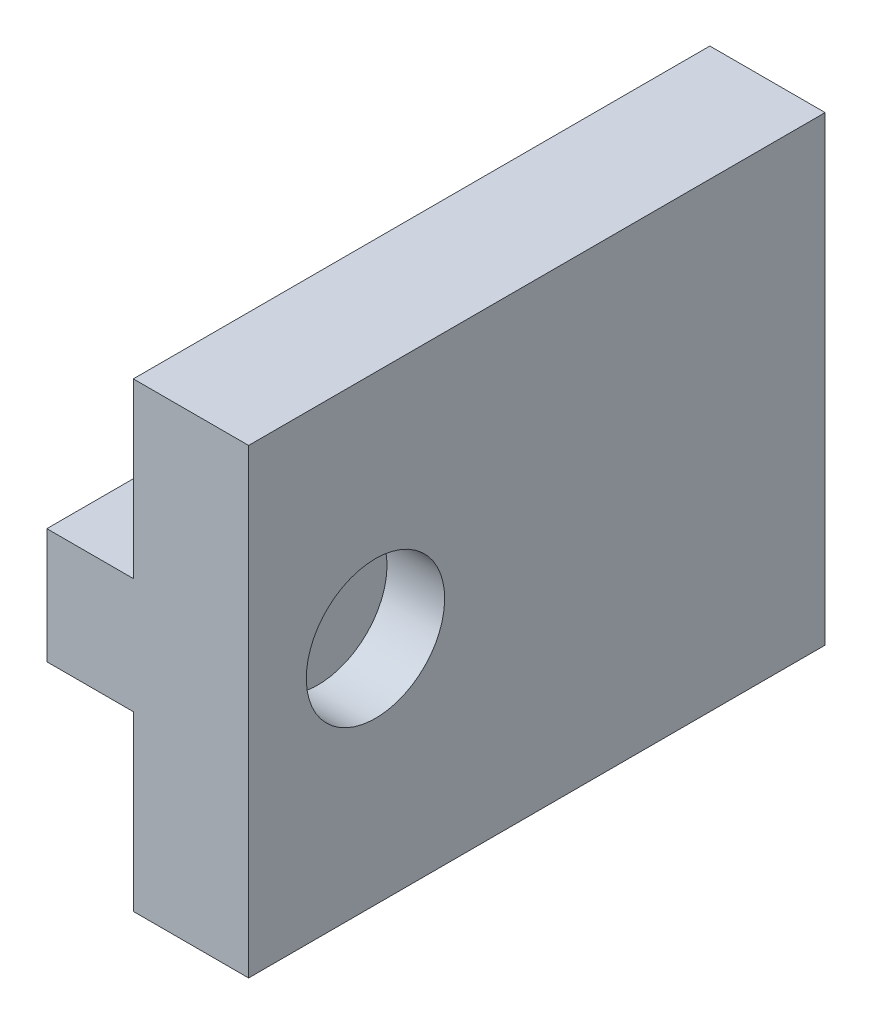
ISO-10303-21;
HEADER;
FILE_DESCRIPTION(('STEP AP214'),'2;1');
FILE_NAME('part.step','',(''),(''),'','','');
FILE_SCHEMA(('AUTOMOTIVE_DESIGN { 1 0 10303 214 1 1 1 1 }'));
ENDSEC;
DATA;
#1=APPLICATION_CONTEXT('core data for automotive mechanical design processes');
#2=APPLICATION_PROTOCOL_DEFINITION('international standard','automotive_design',2000,#1);
#3=PRODUCT_CONTEXT('',#1,'mechanical');
#4=PRODUCT('Part','Part','',(#3));
#5=PRODUCT_RELATED_PRODUCT_CATEGORY('part','',(#4));
#6=PRODUCT_DEFINITION_FORMATION('','',#4);
#7=PRODUCT_DEFINITION_CONTEXT('part definition',#1,'design');
#8=PRODUCT_DEFINITION('design','',#6,#7);
#9=PRODUCT_DEFINITION_SHAPE('','',#8);
#10=(LENGTH_UNIT() NAMED_UNIT(*) SI_UNIT(.MILLI.,.METRE.));
#11=(NAMED_UNIT(*) PLANE_ANGLE_UNIT() SI_UNIT($,.RADIAN.));
#12=(NAMED_UNIT(*) SI_UNIT($,.STERADIAN.) SOLID_ANGLE_UNIT());
#13=UNCERTAINTY_MEASURE_WITH_UNIT(LENGTH_MEASURE(1.E-05),#10,'distance_accuracy_value','');
#14=(GEOMETRIC_REPRESENTATION_CONTEXT(3) GLOBAL_UNCERTAINTY_ASSIGNED_CONTEXT((#13)) GLOBAL_UNIT_ASSIGNED_CONTEXT((#10,
#11,#12)) REPRESENTATION_CONTEXT('',''));
#15=CARTESIAN_POINT('',(0.,0.,0.));
#16=DIRECTION('',(0.,0.,1.));
#17=DIRECTION('',(1.,0.,0.));
#18=AXIS2_PLACEMENT_3D('',#15,#16,#17);
#19=CARTESIAN_POINT('',(17.5,40.,50.));
#20=DIRECTION('',(-1.,0.,0.));
#21=DIRECTION('',(0.,-1.,0.));
#22=AXIS2_PLACEMENT_3D('',#19,#20,#21);
#23=PLANE('',#22);
#24=CARTESIAN_POINT('',(17.5,0.,28.));
#25=DIRECTION('',(1.,0.,0.));
#26=DIRECTION('',(0.,1.,0.));
#27=AXIS2_PLACEMENT_3D('',#24,#25,#26);
#28=CIRCLE('',#27,12.);
#29=CARTESIAN_POINT('',(17.5,12.,28.));
#30=VERTEX_POINT('',#29);
#31=EDGE_CURVE('E179',#30,#30,#28,.T.);
#32=ORIENTED_EDGE('',*,*,#31,.F.);
#33=EDGE_LOOP('',(#32));
#34=FACE_BOUND('',#33,.T.);
#35=DIRECTION('',(0.,1.,0.));
#36=VECTOR('',#35,1.);
#37=CARTESIAN_POINT('',(17.5,40.,-50.));
#38=LINE('',#37,#36);
#39=CARTESIAN_POINT('',(17.5,-40.,-50.));
#40=VERTEX_POINT('',#39);
#41=CARTESIAN_POINT('',(17.5,40.,-50.));
#42=VERTEX_POINT('',#41);
#43=EDGE_CURVE('E106',#40,#42,#38,.T.);
#44=ORIENTED_EDGE('',*,*,#43,.T.);
#45=DIRECTION('',(0.,0.,-1.));
#46=VECTOR('',#45,1.);
#47=CARTESIAN_POINT('',(17.5,40.,50.));
#48=LINE('',#47,#46);
#49=CARTESIAN_POINT('',(17.5,40.,50.));
#50=VERTEX_POINT('',#49);
#51=EDGE_CURVE('E11',#50,#42,#48,.T.);
#52=ORIENTED_EDGE('',*,*,#51,.F.);
#53=DIRECTION('',(0.,1.,0.));
#54=VECTOR('',#53,1.);
#55=CARTESIAN_POINT('',(17.5,40.,50.));
#56=LINE('',#55,#54);
#57=CARTESIAN_POINT('',(17.5,-40.,50.));
#58=VERTEX_POINT('',#57);
#59=EDGE_CURVE('E107',#58,#50,#56,.T.);
#60=ORIENTED_EDGE('',*,*,#59,.F.);
#61=DIRECTION('',(0.,0.,-1.));
#62=VECTOR('',#61,1.);
#63=CARTESIAN_POINT('',(17.5,-40.,50.));
#64=LINE('',#63,#62);
#65=EDGE_CURVE('E25',#58,#40,#64,.T.);
#66=ORIENTED_EDGE('',*,*,#65,.T.);
#67=EDGE_LOOP('',(#44,#52,#60,#66));
#68=FACE_BOUND('',#67,.T.);
#69=ADVANCED_FACE('F17',(#34,#68),#23,.F.);
#70=CARTESIAN_POINT('',(-17.5,40.,50.));
#71=DIRECTION('',(0.,-1.,0.));
#72=DIRECTION('',(0.,0.,-1.));
#73=AXIS2_PLACEMENT_3D('',#70,#71,#72);
#74=PLANE('',#73);
#75=DIRECTION('',(-1.,0.,0.));
#76=VECTOR('',#75,1.);
#77=CARTESIAN_POINT('',(-17.5,40.,-50.));
#78=LINE('',#77,#76);
#79=CARTESIAN_POINT('',(-2.5,40.,-50.));
#80=VERTEX_POINT('',#79);
#81=EDGE_CURVE('E115',#42,#80,#78,.T.);
#82=ORIENTED_EDGE('',*,*,#81,.T.);
#83=DIRECTION('',(0.,0.,1.));
#84=VECTOR('',#83,1.);
#85=CARTESIAN_POINT('',(-2.5,40.,-50.001));
#86=LINE('',#85,#84);
#87=CARTESIAN_POINT('',(-2.5,40.,50.));
#88=VERTEX_POINT('',#87);
#89=EDGE_CURVE('E139',#80,#88,#86,.T.);
#90=ORIENTED_EDGE('',*,*,#89,.T.);
#91=DIRECTION('',(-1.,0.,0.));
#92=VECTOR('',#91,1.);
#93=CARTESIAN_POINT('',(-17.5,40.,50.));
#94=LINE('',#93,#92);
#95=EDGE_CURVE('E112',#50,#88,#94,.T.);
#96=ORIENTED_EDGE('',*,*,#95,.F.);
#97=ORIENTED_EDGE('',*,*,#51,.T.);
#98=EDGE_LOOP('',(#82,#90,#96,#97));
#99=FACE_BOUND('',#98,.T.);
#100=ADVANCED_FACE('F138',(#99),#74,.F.);
#101=CARTESIAN_POINT('',(-17.5,40.,50.));
#102=DIRECTION('',(1.,0.,0.));
#103=DIRECTION('',(0.,1.,0.));
#104=AXIS2_PLACEMENT_3D('',#101,#102,#103);
#105=PLANE('',#104);
#106=DIRECTION('',(0.,-1.,0.));
#107=VECTOR('',#106,1.);
#108=CARTESIAN_POINT('',(-17.5,40.,-50.));
#109=LINE('',#108,#107);
#110=CARTESIAN_POINT('',(-17.5,10.,-50.));
#111=VERTEX_POINT('',#110);
#112=CARTESIAN_POINT('',(-17.5,-10.,-50.));
#113=VERTEX_POINT('',#112);
#114=EDGE_CURVE('E108',#111,#113,#109,.T.);
#115=ORIENTED_EDGE('',*,*,#114,.T.);
#116=DIRECTION('',(0.,0.,1.));
#117=VECTOR('',#116,1.);
#118=CARTESIAN_POINT('',(-17.5,-10.,-50.001));
#119=LINE('',#118,#117);
#120=CARTESIAN_POINT('',(-17.5,-10.,50.));
#121=VERTEX_POINT('',#120);
#122=EDGE_CURVE('E91',#113,#121,#119,.T.);
#123=ORIENTED_EDGE('',*,*,#122,.T.);
#124=DIRECTION('',(0.,-1.,0.));
#125=VECTOR('',#124,1.);
#126=CARTESIAN_POINT('',(-17.5,40.,50.));
#127=LINE('',#126,#125);
#128=CARTESIAN_POINT('',(-17.5,10.,50.));
#129=VERTEX_POINT('',#128);
#130=EDGE_CURVE('E125',#129,#121,#127,.T.);
#131=ORIENTED_EDGE('',*,*,#130,.F.);
#132=DIRECTION('',(0.,0.,1.));
#133=VECTOR('',#132,1.);
#134=CARTESIAN_POINT('',(-17.5,10.,-50.001));
#135=LINE('',#134,#133);
#136=EDGE_CURVE('E155',#111,#129,#135,.T.);
#137=ORIENTED_EDGE('',*,*,#136,.F.);
#138=EDGE_LOOP('',(#115,#123,#131,#137));
#139=FACE_BOUND('',#138,.T.);
#140=ADVANCED_FACE('F176',(#139),#105,.F.);
#141=CARTESIAN_POINT('',(-17.5,-40.,50.));
#142=DIRECTION('',(0.,1.,0.));
#143=DIRECTION('',(0.,0.,1.));
#144=AXIS2_PLACEMENT_3D('',#141,#142,#143);
#145=PLANE('',#144);
#146=DIRECTION('',(1.,0.,0.));
#147=VECTOR('',#146,1.);
#148=CARTESIAN_POINT('',(-17.5,-40.,50.));
#149=LINE('',#148,#147);
#150=CARTESIAN_POINT('',(-2.5,-40.,50.));
#151=VERTEX_POINT('',#150);
#152=EDGE_CURVE('E99',#151,#58,#149,.T.);
#153=ORIENTED_EDGE('',*,*,#152,.F.);
#154=DIRECTION('',(0.,0.,1.));
#155=VECTOR('',#154,1.);
#156=CARTESIAN_POINT('',(-2.5,-40.,-50.001));
#157=LINE('',#156,#155);
#158=CARTESIAN_POINT('',(-2.5,-40.,-50.));
#159=VERTEX_POINT('',#158);
#160=EDGE_CURVE('E85',#159,#151,#157,.T.);
#161=ORIENTED_EDGE('',*,*,#160,.F.);
#162=DIRECTION('',(1.,0.,0.));
#163=VECTOR('',#162,1.);
#164=CARTESIAN_POINT('',(-17.5,-40.,-50.));
#165=LINE('',#164,#163);
#166=EDGE_CURVE('E97',#159,#40,#165,.T.);
#167=ORIENTED_EDGE('',*,*,#166,.T.);
#168=ORIENTED_EDGE('',*,*,#65,.F.);
#169=EDGE_LOOP('',(#153,#161,#167,#168));
#170=FACE_BOUND('',#169,.T.);
#171=ADVANCED_FACE('F95',(#170),#145,.F.);
#172=CARTESIAN_POINT('',(0.,0.,50.));
#173=DIRECTION('',(0.,0.,1.));
#174=DIRECTION('',(1.,0.,0.));
#175=AXIS2_PLACEMENT_3D('',#172,#173,#174);
#176=PLANE('',#175);
#177=DIRECTION('',(-1.,0.,0.));
#178=VECTOR('',#177,1.);
#179=CARTESIAN_POINT('',(-17.5,-10.,50.));
#180=LINE('',#179,#178);
#181=CARTESIAN_POINT('',(-2.5,-10.,50.));
#182=VERTEX_POINT('',#181);
#183=EDGE_CURVE('E101',#182,#121,#180,.T.);
#184=ORIENTED_EDGE('',*,*,#183,.F.);
#185=DIRECTION('',(0.,1.,0.));
#186=VECTOR('',#185,1.);
#187=CARTESIAN_POINT('',(-2.5,-40.,50.));
#188=LINE('',#187,#186);
#189=EDGE_CURVE('E190',#151,#182,#188,.T.);
#190=ORIENTED_EDGE('',*,*,#189,.F.);
#191=ORIENTED_EDGE('',*,*,#152,.T.);
#192=ORIENTED_EDGE('',*,*,#59,.T.);
#193=ORIENTED_EDGE('',*,*,#95,.T.);
#194=DIRECTION('',(0.,1.,0.));
#195=VECTOR('',#194,1.);
#196=CARTESIAN_POINT('',(-2.5,40.,50.));
#197=LINE('',#196,#195);
#198=CARTESIAN_POINT('',(-2.5,10.,50.));
#199=VERTEX_POINT('',#198);
#200=EDGE_CURVE('E151',#199,#88,#197,.T.);
#201=ORIENTED_EDGE('',*,*,#200,.F.);
#202=DIRECTION('',(1.,0.,0.));
#203=VECTOR('',#202,1.);
#204=CARTESIAN_POINT('',(-17.5,10.,50.));
#205=LINE('',#204,#203);
#206=EDGE_CURVE('E145',#129,#199,#205,.T.);
#207=ORIENTED_EDGE('',*,*,#206,.F.);
#208=ORIENTED_EDGE('',*,*,#130,.T.);
#209=EDGE_LOOP('',(#184,#190,#191,#192,#193,#201,#207,#208));
#210=FACE_BOUND('',#209,.T.);
#211=ADVANCED_FACE('F167',(#210),#176,.T.);
#212=CARTESIAN_POINT('',(0.,0.,-50.));
#213=DIRECTION('',(0.,0.,1.));
#214=DIRECTION('',(1.,0.,0.));
#215=AXIS2_PLACEMENT_3D('',#212,#213,#214);
#216=PLANE('',#215);
#217=DIRECTION('',(0.,-1.,0.));
#218=VECTOR('',#217,1.);
#219=CARTESIAN_POINT('',(-2.5,-40.,-50.));
#220=LINE('',#219,#218);
#221=CARTESIAN_POINT('',(-2.5,-10.,-50.));
#222=VERTEX_POINT('',#221);
#223=EDGE_CURVE('E81',#222,#159,#220,.T.);
#224=ORIENTED_EDGE('',*,*,#223,.F.);
#225=DIRECTION('',(1.,0.,0.));
#226=VECTOR('',#225,1.);
#227=CARTESIAN_POINT('',(-17.5,-10.,-50.));
#228=LINE('',#227,#226);
#229=EDGE_CURVE('E32',#113,#222,#228,.T.);
#230=ORIENTED_EDGE('',*,*,#229,.F.);
#231=ORIENTED_EDGE('',*,*,#114,.F.);
#232=DIRECTION('',(-1.,0.,0.));
#233=VECTOR('',#232,1.);
#234=CARTESIAN_POINT('',(-17.5,10.,-50.));
#235=LINE('',#234,#233);
#236=CARTESIAN_POINT('',(-2.5,10.,-50.));
#237=VERTEX_POINT('',#236);
#238=EDGE_CURVE('E134',#237,#111,#235,.T.);
#239=ORIENTED_EDGE('',*,*,#238,.F.);
#240=DIRECTION('',(0.,-1.,0.));
#241=VECTOR('',#240,1.);
#242=CARTESIAN_POINT('',(-2.5,40.,-50.));
#243=LINE('',#242,#241);
#244=EDGE_CURVE('E40',#80,#237,#243,.T.);
#245=ORIENTED_EDGE('',*,*,#244,.F.);
#246=ORIENTED_EDGE('',*,*,#81,.F.);
#247=ORIENTED_EDGE('',*,*,#43,.F.);
#248=ORIENTED_EDGE('',*,*,#166,.F.);
#249=EDGE_LOOP('',(#224,#230,#231,#239,#245,#246,#247,#248));
#250=FACE_BOUND('',#249,.T.);
#251=ADVANCED_FACE('F104',(#250),#216,.F.);
#252=CARTESIAN_POINT('',(-2.5,40.,-50.001));
#253=DIRECTION('',(1.,0.,0.));
#254=DIRECTION('',(0.,1.,0.));
#255=AXIS2_PLACEMENT_3D('',#252,#253,#254);
#256=PLANE('',#255);
#257=ORIENTED_EDGE('',*,*,#244,.T.);
#258=DIRECTION('',(0.,0.,1.));
#259=VECTOR('',#258,1.);
#260=CARTESIAN_POINT('',(-2.5,10.,-50.001));
#261=LINE('',#260,#259);
#262=EDGE_CURVE('E157',#237,#199,#261,.T.);
#263=ORIENTED_EDGE('',*,*,#262,.T.);
#264=ORIENTED_EDGE('',*,*,#200,.T.);
#265=ORIENTED_EDGE('',*,*,#89,.F.);
#266=EDGE_LOOP('',(#257,#263,#264,#265));
#267=FACE_BOUND('',#266,.T.);
#268=ADVANCED_FACE('F204',(#267),#256,.F.);
#269=CARTESIAN_POINT('',(-17.5,10.,-50.001));
#270=DIRECTION('',(0.,-1.,0.));
#271=DIRECTION('',(1.,0.,0.));
#272=AXIS2_PLACEMENT_3D('',#269,#270,#271);
#273=PLANE('',#272);
#274=ORIENTED_EDGE('',*,*,#238,.T.);
#275=ORIENTED_EDGE('',*,*,#136,.T.);
#276=ORIENTED_EDGE('',*,*,#206,.T.);
#277=ORIENTED_EDGE('',*,*,#262,.F.);
#278=EDGE_LOOP('',(#274,#275,#276,#277));
#279=FACE_BOUND('',#278,.T.);
#280=ADVANCED_FACE('F203',(#279),#273,.F.);
#281=CARTESIAN_POINT('',(-17.5,-10.,-50.001));
#282=DIRECTION('',(0.,1.,0.));
#283=DIRECTION('',(-1.,0.,0.));
#284=AXIS2_PLACEMENT_3D('',#281,#282,#283);
#285=PLANE('',#284);
#286=ORIENTED_EDGE('',*,*,#229,.T.);
#287=DIRECTION('',(0.,0.,1.));
#288=VECTOR('',#287,1.);
#289=CARTESIAN_POINT('',(-2.5,-10.,-50.001));
#290=LINE('',#289,#288);
#291=EDGE_CURVE('E87',#222,#182,#290,.T.);
#292=ORIENTED_EDGE('',*,*,#291,.T.);
#293=ORIENTED_EDGE('',*,*,#183,.T.);
#294=ORIENTED_EDGE('',*,*,#122,.F.);
#295=EDGE_LOOP('',(#286,#292,#293,#294));
#296=FACE_BOUND('',#295,.T.);
#297=ADVANCED_FACE('F198',(#296),#285,.F.);
#298=CARTESIAN_POINT('',(-2.5,-40.,-50.001));
#299=DIRECTION('',(1.,0.,0.));
#300=DIRECTION('',(0.,1.,0.));
#301=AXIS2_PLACEMENT_3D('',#298,#299,#300);
#302=PLANE('',#301);
#303=ORIENTED_EDGE('',*,*,#223,.T.);
#304=ORIENTED_EDGE('',*,*,#160,.T.);
#305=ORIENTED_EDGE('',*,*,#189,.T.);
#306=ORIENTED_EDGE('',*,*,#291,.F.);
#307=EDGE_LOOP('',(#303,#304,#305,#306));
#308=FACE_BOUND('',#307,.T.);
#309=ADVANCED_FACE('F83',(#308),#302,.F.);
#310=CARTESIAN_POINT('',(7.5,0.,28.));
#311=DIRECTION('',(1.,0.,0.));
#312=DIRECTION('',(0.,1.,0.));
#313=AXIS2_PLACEMENT_3D('',#310,#311,#312);
#314=CYLINDRICAL_SURFACE('',#313,12.);
#315=CARTESIAN_POINT('',(7.5,0.,28.));
#316=DIRECTION('',(1.,0.,0.));
#317=DIRECTION('',(0.,1.,0.));
#318=AXIS2_PLACEMENT_3D('',#315,#316,#317);
#319=CIRCLE('',#318,12.);
#320=CARTESIAN_POINT('',(7.5,12.,28.));
#321=VERTEX_POINT('',#320);
#322=EDGE_CURVE('E182',#321,#321,#319,.T.);
#323=ORIENTED_EDGE('',*,*,#322,.F.);
#324=EDGE_LOOP('',(#323));
#325=FACE_BOUND('',#324,.T.);
#326=ORIENTED_EDGE('',*,*,#31,.T.);
#327=EDGE_LOOP('',(#326));
#328=FACE_BOUND('',#327,.T.);
#329=ADVANCED_FACE('F274',(#325,#328),#314,.F.);
#330=CARTESIAN_POINT('',(7.5,0.,28.));
#331=DIRECTION('',(1.,0.,0.));
#332=DIRECTION('',(0.,1.,0.));
#333=AXIS2_PLACEMENT_3D('',#330,#331,#332);
#334=PLANE('',#333);
#335=ORIENTED_EDGE('',*,*,#322,.T.);
#336=EDGE_LOOP('',(#335));
#337=FACE_BOUND('',#336,.T.);
#338=ADVANCED_FACE('F282',(#337),#334,.T.);
#339=CLOSED_SHELL('',(#69,#100,#140,#171,#211,#251,#268,#280,#297,#309,#329,#338));
#340=MANIFOLD_SOLID_BREP('B1',#339);
#341=ADVANCED_BREP_SHAPE_REPRESENTATION('',(#18,#340),#14);
#342=SHAPE_DEFINITION_REPRESENTATION(#9,#341);
ENDSEC;
END-ISO-10303-21;
